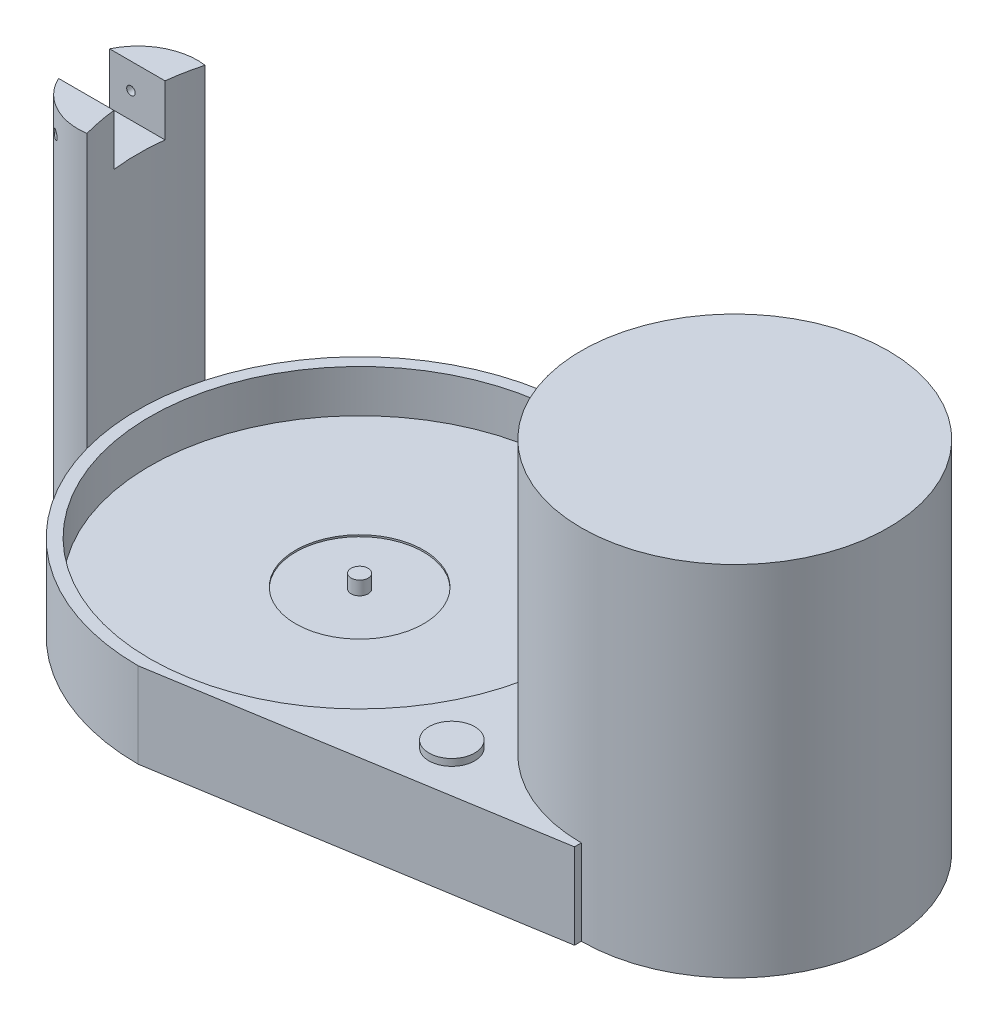
ISO-10303-21;
HEADER;
FILE_DESCRIPTION(('STEP AP214'),'2;1');
FILE_NAME('part.step','',(''),(''),'','','');
FILE_SCHEMA(('AUTOMOTIVE_DESIGN { 1 0 10303 214 1 1 1 1 }'));
ENDSEC;
DATA;
#1=APPLICATION_CONTEXT('core data for automotive mechanical design processes');
#2=APPLICATION_PROTOCOL_DEFINITION('international standard','automotive_design',2000,#1);
#3=PRODUCT_CONTEXT('',#1,'mechanical');
#4=PRODUCT('Part','Part','',(#3));
#5=PRODUCT_RELATED_PRODUCT_CATEGORY('part','',(#4));
#6=PRODUCT_DEFINITION_FORMATION('','',#4);
#7=PRODUCT_DEFINITION_CONTEXT('part definition',#1,'design');
#8=PRODUCT_DEFINITION('design','',#6,#7);
#9=PRODUCT_DEFINITION_SHAPE('','',#8);
#10=(LENGTH_UNIT() NAMED_UNIT(*) SI_UNIT(.MILLI.,.METRE.));
#11=(NAMED_UNIT(*) PLANE_ANGLE_UNIT() SI_UNIT($,.RADIAN.));
#12=(NAMED_UNIT(*) SI_UNIT($,.STERADIAN.) SOLID_ANGLE_UNIT());
#13=UNCERTAINTY_MEASURE_WITH_UNIT(LENGTH_MEASURE(1.E-05),#10,'distance_accuracy_value','');
#14=(GEOMETRIC_REPRESENTATION_CONTEXT(3) GLOBAL_UNCERTAINTY_ASSIGNED_CONTEXT((#13)) GLOBAL_UNIT_ASSIGNED_CONTEXT((#10,
#11,#12)) REPRESENTATION_CONTEXT('',''));
#15=CARTESIAN_POINT('',(0.,0.,0.));
#16=DIRECTION('',(0.,0.,1.));
#17=DIRECTION('',(1.,0.,0.));
#18=AXIS2_PLACEMENT_3D('',#15,#16,#17);
#19=CARTESIAN_POINT('',(0.,210.,0.));
#20=DIRECTION('',(0.,1.,0.));
#21=DIRECTION('',(0.,0.,1.));
#22=AXIS2_PLACEMENT_3D('',#19,#20,#21);
#23=PLANE('',#22);
#24=DIRECTION('',(-1.,0.,0.));
#25=VECTOR('',#24,1.);
#26=CARTESIAN_POINT('',(-161.622776601684,210.,-15.));
#27=LINE('',#26,#25);
#28=CARTESIAN_POINT('',(-129.13171570145,210.,-15.));
#29=VERTEX_POINT('',#28);
#30=CARTESIAN_POINT('',(-161.622776601684,210.,-15.));
#31=VERTEX_POINT('',#30);
#32=EDGE_CURVE('E157',#29,#31,#27,.T.);
#33=ORIENTED_EDGE('',*,*,#32,.F.);
#34=CARTESIAN_POINT('',(0.,210.,0.));
#35=DIRECTION('',(0.,1.,0.));
#36=DIRECTION('',(0.,0.,1.));
#37=AXIS2_PLACEMENT_3D('',#34,#35,#36);
#38=CIRCLE('',#37,130.);
#39=CARTESIAN_POINT('',(-125.288461538462,210.,-34.6814273830453));
#40=VERTEX_POINT('',#39);
#41=EDGE_CURVE('E181',#40,#29,#38,.T.);
#42=ORIENTED_EDGE('',*,*,#41,.F.);
#43=CARTESIAN_POINT('',(-130.,210.,0.));
#44=DIRECTION('',(0.,1.,0.));
#45=DIRECTION('',(0.,0.,1.));
#46=AXIS2_PLACEMENT_3D('',#43,#44,#45);
#47=CIRCLE('',#46,35.);
#48=EDGE_CURVE('E186',#40,#31,#47,.T.);
#49=ORIENTED_EDGE('',*,*,#48,.T.);
#50=EDGE_LOOP('',(#33,#42,#49));
#51=FACE_BOUND('',#50,.T.);
#52=ADVANCED_FACE('F41',(#51),#23,.T.);
#53=CARTESIAN_POINT('',(0.,50.,0.));
#54=DIRECTION('',(0.,-1.,0.));
#55=DIRECTION('',(0.,0.,-1.));
#56=AXIS2_PLACEMENT_3D('',#53,#54,#55);
#57=CYLINDRICAL_SURFACE('',#56,130.);
#58=DIRECTION('',(0.,-1.,0.));
#59=VECTOR('',#58,1.);
#60=CARTESIAN_POINT('',(-125.288461538462,210.,-34.6814273830453));
#61=LINE('',#60,#59);
#62=CARTESIAN_POINT('',(-125.288461538462,50.,-34.6814273830453));
#63=VERTEX_POINT('',#62);
#64=CARTESIAN_POINT('',(-125.288461538462,0.,-34.6814273830453));
#65=VERTEX_POINT('',#64);
#66=EDGE_CURVE('E195',#63,#65,#61,.T.);
#67=ORIENTED_EDGE('',*,*,#66,.F.);
#68=CARTESIAN_POINT('',(0.,50.,0.));
#69=DIRECTION('',(0.,1.,0.));
#70=DIRECTION('',(0.,0.,1.));
#71=AXIS2_PLACEMENT_3D('',#68,#69,#70);
#72=CIRCLE('',#71,130.);
#73=CARTESIAN_POINT('',(0.,50.,-130.));
#74=VERTEX_POINT('',#73);
#75=EDGE_CURVE('E214',#74,#63,#72,.T.);
#76=ORIENTED_EDGE('',*,*,#75,.F.);
#77=DIRECTION('',(0.,-1.,0.));
#78=VECTOR('',#77,1.);
#79=CARTESIAN_POINT('',(0.,50.,-130.));
#80=LINE('',#79,#78);
#81=CARTESIAN_POINT('',(0.,0.,-130.));
#82=VERTEX_POINT('',#81);
#83=EDGE_CURVE('E256',#74,#82,#80,.T.);
#84=ORIENTED_EDGE('',*,*,#83,.T.);
#85=CARTESIAN_POINT('',(0.,0.,0.));
#86=DIRECTION('',(0.,1.,0.));
#87=DIRECTION('',(0.,0.,1.));
#88=AXIS2_PLACEMENT_3D('',#85,#86,#87);
#89=CIRCLE('',#88,130.);
#90=EDGE_CURVE('E235',#82,#65,#89,.T.);
#91=ORIENTED_EDGE('',*,*,#90,.T.);
#92=EDGE_LOOP('',(#67,#76,#84,#91));
#93=FACE_BOUND('',#92,.T.);
#94=ADVANCED_FACE('F371',(#93),#57,.T.);
#95=DIRECTION('',(0.,-1.,0.));
#96=VECTOR('',#95,1.);
#97=CARTESIAN_POINT('',(-125.288461538462,210.,34.6814273830453));
#98=LINE('',#97,#96);
#99=CARTESIAN_POINT('',(-125.288461538462,50.,34.6814273830453));
#100=VERTEX_POINT('',#99);
#101=CARTESIAN_POINT('',(-125.288461538462,0.,34.6814273830453));
#102=VERTEX_POINT('',#101);
#103=EDGE_CURVE('E190',#100,#102,#98,.T.);
#104=ORIENTED_EDGE('',*,*,#103,.T.);
#105=CARTESIAN_POINT('',(0.,0.,130.));
#106=VERTEX_POINT('',#105);
#107=EDGE_CURVE('E234',#102,#106,#89,.T.);
#108=ORIENTED_EDGE('',*,*,#107,.T.);
#109=DIRECTION('',(0.,-1.,0.));
#110=VECTOR('',#109,1.);
#111=CARTESIAN_POINT('',(0.,50.,130.));
#112=LINE('',#111,#110);
#113=CARTESIAN_POINT('',(0.,50.,130.));
#114=VERTEX_POINT('',#113);
#115=EDGE_CURVE('E252',#114,#106,#112,.T.);
#116=ORIENTED_EDGE('',*,*,#115,.F.);
#117=EDGE_CURVE('E213',#100,#114,#72,.T.);
#118=ORIENTED_EDGE('',*,*,#117,.F.);
#119=EDGE_LOOP('',(#104,#108,#116,#118));
#120=FACE_BOUND('',#119,.T.);
#121=ADVANCED_FACE('F298',(#120),#57,.T.);
#122=CARTESIAN_POINT('',(220.,210.,0.));
#123=DIRECTION('',(0.,-1.,0.));
#124=DIRECTION('',(0.,0.,-1.));
#125=AXIS2_PLACEMENT_3D('',#122,#123,#124);
#126=CYLINDRICAL_SURFACE('',#125,90.);
#127=CARTESIAN_POINT('',(220.,210.,0.));
#128=DIRECTION('',(0.,1.,0.));
#129=DIRECTION('',(0.,0.,1.));
#130=AXIS2_PLACEMENT_3D('',#127,#128,#129);
#131=CIRCLE('',#130,90.);
#132=CARTESIAN_POINT('',(220.,210.,90.));
#133=VERTEX_POINT('',#132);
#134=EDGE_CURVE('E11',#133,#133,#131,.T.);
#135=ORIENTED_EDGE('',*,*,#134,.F.);
#136=EDGE_LOOP('',(#135));
#137=FACE_BOUND('',#136,.T.);
#138=CARTESIAN_POINT('',(220.,0.,0.));
#139=DIRECTION('',(0.,1.,0.));
#140=DIRECTION('',(0.,0.,1.));
#141=AXIS2_PLACEMENT_3D('',#138,#139,#140);
#142=CIRCLE('',#141,90.);
#143=CARTESIAN_POINT('',(220.,0.,90.));
#144=VERTEX_POINT('',#143);
#145=CARTESIAN_POINT('',(220.,0.,-90.));
#146=VERTEX_POINT('',#145);
#147=EDGE_CURVE('E51',#144,#146,#142,.T.);
#148=ORIENTED_EDGE('',*,*,#147,.T.);
#149=DIRECTION('',(0.,-1.,0.));
#150=VECTOR('',#149,1.);
#151=CARTESIAN_POINT('',(220.,50.,-90.));
#152=LINE('',#151,#150);
#153=CARTESIAN_POINT('',(220.,50.,-90.));
#154=VERTEX_POINT('',#153);
#155=EDGE_CURVE('E262',#154,#146,#152,.T.);
#156=ORIENTED_EDGE('',*,*,#155,.F.);
#157=CARTESIAN_POINT('',(220.,50.,0.));
#158=DIRECTION('',(0.,1.,0.));
#159=DIRECTION('',(0.,0.,1.));
#160=AXIS2_PLACEMENT_3D('',#157,#158,#159);
#161=CIRCLE('',#160,90.);
#162=CARTESIAN_POINT('',(220.,50.,90.));
#163=VERTEX_POINT('',#162);
#164=EDGE_CURVE('E201',#154,#163,#161,.T.);
#165=ORIENTED_EDGE('',*,*,#164,.T.);
#166=DIRECTION('',(0.,-1.,0.));
#167=VECTOR('',#166,1.);
#168=CARTESIAN_POINT('',(220.,50.,90.));
#169=LINE('',#168,#167);
#170=EDGE_CURVE('E226',#163,#144,#169,.T.);
#171=ORIENTED_EDGE('',*,*,#170,.T.);
#172=EDGE_LOOP('',(#148,#156,#165,#171));
#173=FACE_BOUND('',#172,.T.);
#174=ADVANCED_FACE('F43',(#137,#173),#126,.T.);
#175=CARTESIAN_POINT('',(0.,210.,0.));
#176=DIRECTION('',(0.,1.,0.));
#177=DIRECTION('',(0.,0.,1.));
#178=AXIS2_PLACEMENT_3D('',#175,#176,#177);
#179=PLANE('',#178);
#180=ORIENTED_EDGE('',*,*,#134,.T.);
#181=EDGE_LOOP('',(#180));
#182=FACE_BOUND('',#181,.T.);
#183=ADVANCED_FACE('F399',(#182),#179,.T.);
#184=CARTESIAN_POINT('',(0.,0.,0.));
#185=DIRECTION('',(0.,1.,0.));
#186=DIRECTION('',(0.,0.,1.));
#187=AXIS2_PLACEMENT_3D('',#184,#185,#186);
#188=PLANE('',#187);
#189=ORIENTED_EDGE('',*,*,#147,.F.);
#190=DIRECTION('',(0.,0.,-1.));
#191=VECTOR('',#190,1.);
#192=CARTESIAN_POINT('',(220.,0.,0.));
#193=LINE('',#192,#191);
#194=CARTESIAN_POINT('',(220.,0.,94.));
#195=VERTEX_POINT('',#194);
#196=EDGE_CURVE('E205',#195,#144,#193,.T.);
#197=ORIENTED_EDGE('',*,*,#196,.F.);
#198=DIRECTION('',(0.98687458289775,0.,-0.161488568110541));
#199=VECTOR('',#198,1.);
#200=CARTESIAN_POINT('',(20.7179652285898,0.,126.609787508049));
#201=LINE('',#200,#199);
#202=EDGE_CURVE('E239',#106,#195,#201,.T.);
#203=ORIENTED_EDGE('',*,*,#202,.F.);
#204=ORIENTED_EDGE('',*,*,#107,.F.);
#205=CARTESIAN_POINT('',(-130.,0.,0.));
#206=DIRECTION('',(0.,1.,0.));
#207=DIRECTION('',(0.,0.,1.));
#208=AXIS2_PLACEMENT_3D('',#205,#206,#207);
#209=CIRCLE('',#208,35.);
#210=EDGE_CURVE('E175',#65,#102,#209,.T.);
#211=ORIENTED_EDGE('',*,*,#210,.F.);
#212=ORIENTED_EDGE('',*,*,#90,.F.);
#213=DIRECTION('',(0.98687458289775,0.,0.161488568110541));
#214=VECTOR('',#213,1.);
#215=CARTESIAN_POINT('',(20.7179652285898,0.,-126.609787508049));
#216=LINE('',#215,#214);
#217=CARTESIAN_POINT('',(220.,0.,-94.));
#218=VERTEX_POINT('',#217);
#219=EDGE_CURVE('E230',#82,#218,#216,.T.);
#220=ORIENTED_EDGE('',*,*,#219,.T.);
#221=DIRECTION('',(0.,0.,1.));
#222=VECTOR('',#221,1.);
#223=CARTESIAN_POINT('',(220.,0.,0.));
#224=LINE('',#223,#222);
#225=EDGE_CURVE('E200',#218,#146,#224,.T.);
#226=ORIENTED_EDGE('',*,*,#225,.T.);
#227=EDGE_LOOP('',(#189,#197,#203,#204,#211,#212,#220,#226));
#228=FACE_BOUND('',#227,.T.);
#229=ADVANCED_FACE('F275',(#228),#188,.F.);
#230=CARTESIAN_POINT('',(220.,50.,0.));
#231=DIRECTION('',(1.,0.,0.));
#232=DIRECTION('',(0.,0.,-1.));
#233=AXIS2_PLACEMENT_3D('',#230,#231,#232);
#234=PLANE('',#233);
#235=ORIENTED_EDGE('',*,*,#225,.F.);
#236=DIRECTION('',(0.,-1.,0.));
#237=VECTOR('',#236,1.);
#238=CARTESIAN_POINT('',(220.,50.,-94.));
#239=LINE('',#238,#237);
#240=CARTESIAN_POINT('',(220.,50.,-94.));
#241=VERTEX_POINT('',#240);
#242=EDGE_CURVE('E259',#241,#218,#239,.T.);
#243=ORIENTED_EDGE('',*,*,#242,.F.);
#244=DIRECTION('',(0.,0.,1.));
#245=VECTOR('',#244,1.);
#246=CARTESIAN_POINT('',(220.,50.,0.));
#247=LINE('',#246,#245);
#248=EDGE_CURVE('E204',#241,#154,#247,.T.);
#249=ORIENTED_EDGE('',*,*,#248,.T.);
#250=ORIENTED_EDGE('',*,*,#155,.T.);
#251=EDGE_LOOP('',(#235,#243,#249,#250));
#252=FACE_BOUND('',#251,.T.);
#253=ADVANCED_FACE('F273',(#252),#234,.T.);
#254=CARTESIAN_POINT('',(20.7179652285898,50.,-126.609787508049));
#255=DIRECTION('',(0.161488568110541,0.,-0.98687458289775));
#256=DIRECTION('',(-0.98687458289775,0.,-0.161488568110541));
#257=AXIS2_PLACEMENT_3D('',#254,#255,#256);
#258=PLANE('',#257);
#259=ORIENTED_EDGE('',*,*,#219,.F.);
#260=ORIENTED_EDGE('',*,*,#83,.F.);
#261=DIRECTION('',(0.98687458289775,0.,0.161488568110541));
#262=VECTOR('',#261,1.);
#263=CARTESIAN_POINT('',(20.7179652285898,50.,-126.609787508049));
#264=LINE('',#263,#262);
#265=EDGE_CURVE('E209',#74,#241,#264,.T.);
#266=ORIENTED_EDGE('',*,*,#265,.T.);
#267=ORIENTED_EDGE('',*,*,#242,.T.);
#268=EDGE_LOOP('',(#259,#260,#266,#267));
#269=FACE_BOUND('',#268,.T.);
#270=ADVANCED_FACE('F280',(#269),#258,.T.);
#271=CARTESIAN_POINT('',(20.7179652285898,50.,126.609787508049));
#272=DIRECTION('',(-0.161488568110541,0.,-0.98687458289775));
#273=DIRECTION('',(-0.98687458289775,0.,0.161488568110541));
#274=AXIS2_PLACEMENT_3D('',#271,#272,#273);
#275=PLANE('',#274);
#276=ORIENTED_EDGE('',*,*,#202,.T.);
#277=DIRECTION('',(0.,-1.,0.));
#278=VECTOR('',#277,1.);
#279=CARTESIAN_POINT('',(220.,50.,94.));
#280=LINE('',#279,#278);
#281=CARTESIAN_POINT('',(220.,50.,94.));
#282=VERTEX_POINT('',#281);
#283=EDGE_CURVE('E248',#282,#195,#280,.T.);
#284=ORIENTED_EDGE('',*,*,#283,.F.);
#285=DIRECTION('',(0.98687458289775,0.,-0.161488568110541));
#286=VECTOR('',#285,1.);
#287=CARTESIAN_POINT('',(20.7179652285898,50.,126.609787508049));
#288=LINE('',#287,#286);
#289=EDGE_CURVE('E218',#114,#282,#288,.T.);
#290=ORIENTED_EDGE('',*,*,#289,.F.);
#291=ORIENTED_EDGE('',*,*,#115,.T.);
#292=EDGE_LOOP('',(#276,#284,#290,#291));
#293=FACE_BOUND('',#292,.T.);
#294=ADVANCED_FACE('F293',(#293),#275,.F.);
#295=CARTESIAN_POINT('',(220.,50.,0.));
#296=DIRECTION('',(-1.,0.,0.));
#297=DIRECTION('',(0.,0.,1.));
#298=AXIS2_PLACEMENT_3D('',#295,#296,#297);
#299=PLANE('',#298);
#300=ORIENTED_EDGE('',*,*,#196,.T.);
#301=ORIENTED_EDGE('',*,*,#170,.F.);
#302=DIRECTION('',(0.,0.,-1.));
#303=VECTOR('',#302,1.);
#304=CARTESIAN_POINT('',(220.,50.,0.));
#305=LINE('',#304,#303);
#306=EDGE_CURVE('E222',#282,#163,#305,.T.);
#307=ORIENTED_EDGE('',*,*,#306,.F.);
#308=ORIENTED_EDGE('',*,*,#283,.T.);
#309=EDGE_LOOP('',(#300,#301,#307,#308));
#310=FACE_BOUND('',#309,.T.);
#311=ADVANCED_FACE('F289',(#310),#299,.F.);
#312=CARTESIAN_POINT('',(0.,50.,0.));
#313=DIRECTION('',(0.,1.,0.));
#314=DIRECTION('',(0.,0.,1.));
#315=AXIS2_PLACEMENT_3D('',#312,#313,#314);
#316=PLANE('',#315);
#317=CARTESIAN_POINT('',(133.690962694127,50.,79.6250602421491));
#318=DIRECTION('',(0.,1.,0.));
#319=DIRECTION('',(0.,0.,1.));
#320=AXIS2_PLACEMENT_3D('',#317,#318,#319);
#321=CIRCLE('',#320,13.4018473309973);
#322=CARTESIAN_POINT('',(133.690962694127,50.,93.0269075731463));
#323=VERTEX_POINT('',#322);
#324=EDGE_CURVE('E628',#323,#323,#321,.T.);
#325=ORIENTED_EDGE('',*,*,#324,.F.);
#326=EDGE_LOOP('',(#325));
#327=FACE_BOUND('',#326,.T.);
#328=CARTESIAN_POINT('',(0.,50.,0.));
#329=DIRECTION('',(0.,1.,0.));
#330=DIRECTION('',(0.,0.,1.));
#331=AXIS2_PLACEMENT_3D('',#328,#329,#330);
#332=CIRCLE('',#331,123.);
#333=CARTESIAN_POINT('',(0.,50.,123.));
#334=VERTEX_POINT('',#333);
#335=EDGE_CURVE('E176',#334,#334,#332,.T.);
#336=ORIENTED_EDGE('',*,*,#335,.F.);
#337=EDGE_LOOP('',(#336));
#338=FACE_BOUND('',#337,.T.);
#339=ORIENTED_EDGE('',*,*,#164,.F.);
#340=ORIENTED_EDGE('',*,*,#248,.F.);
#341=ORIENTED_EDGE('',*,*,#265,.F.);
#342=ORIENTED_EDGE('',*,*,#75,.T.);
#343=EDGE_CURVE('E219',#63,#100,#72,.T.);
#344=ORIENTED_EDGE('',*,*,#343,.T.);
#345=ORIENTED_EDGE('',*,*,#117,.T.);
#346=ORIENTED_EDGE('',*,*,#289,.T.);
#347=ORIENTED_EDGE('',*,*,#306,.T.);
#348=EDGE_LOOP('',(#339,#340,#341,#342,#344,#345,#346,#347));
#349=FACE_BOUND('',#348,.T.);
#350=ADVANCED_FACE('F284',(#327,#338,#349),#316,.T.);
#351=CARTESIAN_POINT('',(0.,210.,0.));
#352=DIRECTION('',(0.,-1.,0.));
#353=DIRECTION('',(0.,0.,-1.));
#354=AXIS2_PLACEMENT_3D('',#351,#352,#353);
#355=CYLINDRICAL_SURFACE('',#354,130.);
#356=DIRECTION('',(0.,1.,0.));
#357=VECTOR('',#356,1.);
#358=CARTESIAN_POINT('',(-129.13171570145,180.,-15.));
#359=LINE('',#358,#357);
#360=CARTESIAN_POINT('',(-129.13171570145,180.,-15.));
#361=VERTEX_POINT('',#360);
#362=EDGE_CURVE('E166',#361,#29,#359,.T.);
#363=ORIENTED_EDGE('',*,*,#362,.F.);
#364=CARTESIAN_POINT('',(5.07927033766009E-12,180.,0.));
#365=DIRECTION('',(0.,-1.,0.));
#366=DIRECTION('',(0.,0.,1.));
#367=AXIS2_PLACEMENT_3D('',#364,#365,#366);
#368=CIRCLE('',#367,130.000000000005);
#369=CARTESIAN_POINT('',(-129.13171570145,180.,15.));
#370=VERTEX_POINT('',#369);
#371=EDGE_CURVE('E146',#370,#361,#368,.T.);
#372=ORIENTED_EDGE('',*,*,#371,.F.);
#373=DIRECTION('',(0.,1.,0.));
#374=VECTOR('',#373,1.);
#375=CARTESIAN_POINT('',(-129.13171570145,180.,15.));
#376=LINE('',#375,#374);
#377=CARTESIAN_POINT('',(-129.13171570145,210.,15.));
#378=VERTEX_POINT('',#377);
#379=EDGE_CURVE('E142',#370,#378,#376,.T.);
#380=ORIENTED_EDGE('',*,*,#379,.T.);
#381=CARTESIAN_POINT('',(-125.288461538462,210.,34.6814273830453));
#382=VERTEX_POINT('',#381);
#383=EDGE_CURVE('E185',#378,#382,#38,.T.);
#384=ORIENTED_EDGE('',*,*,#383,.T.);
#385=EDGE_CURVE('E67',#382,#100,#98,.T.);
#386=ORIENTED_EDGE('',*,*,#385,.T.);
#387=ORIENTED_EDGE('',*,*,#343,.F.);
#388=EDGE_CURVE('E196',#40,#63,#61,.T.);
#389=ORIENTED_EDGE('',*,*,#388,.F.);
#390=ORIENTED_EDGE('',*,*,#41,.T.);
#391=EDGE_LOOP('',(#363,#372,#380,#384,#386,#387,#389,#390));
#392=FACE_BOUND('',#391,.T.);
#393=ADVANCED_FACE('F368',(#392),#355,.F.);
#394=CARTESIAN_POINT('',(-130.,210.,0.));
#395=DIRECTION('',(0.,-1.,0.));
#396=DIRECTION('',(0.,0.,-1.));
#397=AXIS2_PLACEMENT_3D('',#394,#395,#396);
#398=CYLINDRICAL_SURFACE('',#397,35.);
#399=CARTESIAN_POINT('',(-151.63171570145,195.,27.5148846229029));
#400=CARTESIAN_POINT('',(-151.631715312989,195.119758558458,27.5148849931018));
#401=CARTESIAN_POINT('',(-151.623056908834,195.239520718774,27.5216986290535));
#402=CARTESIAN_POINT('',(-151.589036170781,195.475145372266,27.5483931782411));
#403=CARTESIAN_POINT('',(-151.563667006613,195.591006250488,27.5682794347076));
#404=CARTESIAN_POINT('',(-151.498005471743,195.815010383296,27.6195123641804));
#405=CARTESIAN_POINT('',(-151.457787363083,195.923188901859,27.6508019971221));
#406=CARTESIAN_POINT('',(-151.364480532346,196.130347035049,27.7229586868469));
#407=CARTESIAN_POINT('',(-151.311387900382,196.229323842536,27.7638286529721));
#408=CARTESIAN_POINT('',(-151.189589760409,196.424595084574,27.8569132688365));
#409=CARTESIAN_POINT('',(-151.119956404808,196.519991372901,27.9097864537963));
#410=CARTESIAN_POINT('',(-150.970442501132,196.697821509444,28.0223002223774));
#411=CARTESIAN_POINT('',(-150.890557331076,196.780249473412,28.0819438570134));
#412=CARTESIAN_POINT('',(-150.705135909921,196.947561829607,28.2190219869201));
#413=CARTESIAN_POINT('',(-150.597711318554,197.029429441325,28.2975849773534));
#414=CARTESIAN_POINT('',(-150.37368830976,197.173772686032,28.4593037021187));
#415=CARTESIAN_POINT('',(-150.257083171311,197.236233943135,28.5424627876993));
#416=CARTESIAN_POINT('',(-149.994871328254,197.351397072205,28.7269083331641));
#417=CARTESIAN_POINT('',(-149.847885769789,197.400165909923,28.8287061503059));
#418=CARTESIAN_POINT('',(-149.547859029422,197.469933308341,29.0329849050699));
#419=CARTESIAN_POINT('',(-149.394814210707,197.490914922506,29.135466221286));
#420=CARTESIAN_POINT('',(-149.072405709609,197.504949059876,29.3476360273725));
#421=CARTESIAN_POINT('',(-148.902802490886,197.495348034378,29.4571536209593));
#422=CARTESIAN_POINT('',(-148.565672684186,197.441051928878,29.6707870505493));
#423=CARTESIAN_POINT('',(-148.398146206947,197.396354985556,29.774902599433));
#424=CARTESIAN_POINT('',(-148.078485520663,197.273484964871,29.9700168871959));
#425=CARTESIAN_POINT('',(-147.925999090784,197.196838247045,30.0613876109236));
#426=CARTESIAN_POINT('',(-147.635578640099,197.010296983666,30.2326766854155));
#427=CARTESIAN_POINT('',(-147.497628871122,196.900438927262,30.3126074638997));
#428=CARTESIAN_POINT('',(-147.26169562872,196.66633187382,30.447492389365));
#429=CARTESIAN_POINT('',(-147.160824645951,196.546144321927,30.5043700124386));
#430=CARTESIAN_POINT('',(-147.026436925387,196.350585835106,30.5794555020499));
#431=CARTESIAN_POINT('',(-146.984459017764,196.282849447269,30.6027798151415));
#432=CARTESIAN_POINT('',(-146.906758931886,196.142794697972,30.6457740118231));
#433=CARTESIAN_POINT('',(-146.871035614928,196.07047717382,30.6654445606535));
#434=CARTESIAN_POINT('',(-146.783986632201,195.870066243055,30.71321759212));
#435=CARTESIAN_POINT('',(-146.739108890661,195.73818749889,30.7376587433866));
#436=CARTESIAN_POINT('',(-146.671814833077,195.467287190705,30.7742114610122));
#437=CARTESIAN_POINT('',(-146.649382194112,195.328270894845,30.7863319874943));
#438=CARTESIAN_POINT('',(-146.629255804696,195.061626287729,30.7972068701995));
#439=CARTESIAN_POINT('',(-146.629364111534,194.934208516805,30.7971487487569));
#440=CARTESIAN_POINT('',(-146.648870975155,194.681320818604,30.7866077913476));
#441=CARTESIAN_POINT('',(-146.668265349643,194.555850475007,30.7761272155504));
#442=CARTESIAN_POINT('',(-146.724751901388,194.313188320685,30.7454657439807));
#443=CARTESIAN_POINT('',(-146.761445367035,194.195875113886,30.7255033130968));
#444=CARTESIAN_POINT('',(-146.850738973045,193.969485749209,30.6766225777515));
#445=CARTESIAN_POINT('',(-146.903341162807,193.860410654848,30.6477031194141));
#446=CARTESIAN_POINT('',(-147.025133608637,193.647966972,30.5802203129799));
#447=CARTESIAN_POINT('',(-147.094981588302,193.545099743045,30.5412709851857));
#448=CARTESIAN_POINT('',(-147.247151297702,193.352736825889,30.4555970396998));
#449=CARTESIAN_POINT('',(-147.32947724286,193.26324567689,30.4088697938736));
#450=CARTESIAN_POINT('',(-147.512667157073,193.090531902525,30.3037736082762));
#451=CARTESIAN_POINT('',(-147.614561507734,193.008829166398,30.2447079500211));
#452=CARTESIAN_POINT('',(-147.826917028015,192.863631368349,30.1200300948048));
#453=CARTESIAN_POINT('',(-147.937382255918,192.800144999487,30.0544147923427));
#454=CARTESIAN_POINT('',(-148.179078838709,192.684237945769,29.9089201488289));
#455=CARTESIAN_POINT('',(-148.311115277723,192.634421030899,29.8283053954611));
#456=CARTESIAN_POINT('',(-148.578812295178,192.557930141074,29.662309357768));
#457=CARTESIAN_POINT('',(-148.71447459531,192.531267369271,29.5769257872869));
#458=CARTESIAN_POINT('',(-149.004867166476,192.498389617997,29.3913005841243));
#459=CARTESIAN_POINT('',(-149.159686935602,192.495440187973,29.2906149480464));
#460=CARTESIAN_POINT('',(-149.466367701971,192.517726705415,29.087702116126));
#461=CARTESIAN_POINT('',(-149.618226085862,192.542986494771,28.985473688432));
#462=CARTESIAN_POINT('',(-149.928590344001,192.624508179543,28.7730716094037));
#463=CARTESIAN_POINT('',(-150.086502079156,192.683306778543,28.6629920005479));
#464=CARTESIAN_POINT('',(-150.390039192079,192.833151679725,28.4478616684821));
#465=CARTESIAN_POINT('',(-150.535672459298,192.924177076228,28.3428077351235));
#466=CARTESIAN_POINT('',(-150.779127291603,193.114686788082,28.1646134834459));
#467=CARTESIAN_POINT('',(-150.880425472418,193.207924525206,28.0895308898053));
#468=CARTESIAN_POINT('',(-151.068897268149,193.413583918739,27.948441251804));
#469=CARTESIAN_POINT('',(-151.156090403467,193.525978612808,27.8824216843502));
#470=CARTESIAN_POINT('',(-151.298014342783,193.746577237117,27.774107974068));
#471=CARTESIAN_POINT('',(-151.355765728454,193.85178503185,27.729682996725));
#472=CARTESIAN_POINT('',(-151.456581216056,194.072795140894,27.6517484501076));
#473=CARTESIAN_POINT('',(-151.499657661444,194.188588446959,27.6182297083989));
#474=CARTESIAN_POINT('',(-151.565976476137,194.41895304753,27.5664707464559));
#475=CARTESIAN_POINT('',(-151.590487472341,194.53293591094,27.5472552626607));
#476=CARTESIAN_POINT('',(-151.623354168685,194.764612320016,27.5214644500892));
#477=CARTESIAN_POINT('',(-151.631716083218,194.88230442059,27.5148842590812));
#478=CARTESIAN_POINT('',(-151.63171570145,195.,27.5148846229029));
#479=B_SPLINE_CURVE_WITH_KNOTS('',3,(#399,#400,#401,#402,#403,#404,#405,#406,#407,#408,#409,
#410,#411,#412,#413,#414,#415,#416,#417,#418,#419,#420,#421,#422,#423,#424,#425,#426,#427,#428,
#429,#430,#431,#432,#433,#434,#435,#436,#437,#438,#439,#440,#441,#442,#443,#444,#445,#446,#447,
#448,#449,#450,#451,#452,#453,#454,#455,#456,#457,#458,#459,#460,#461,#462,#463,#464,#465,#466,
#467,#468,#469,#470,#471,#472,#473,#474,#475,#476,#477,#478),.UNSPECIFIED.,.T.,.F.,(4,2,2,2,2,2,
2,2,2,2,2,2,2,2,2,2,2,2,2,2,2,2,2,2,2,2,2,2,2,2,2,2,2,2,2,2,2,2,2,4),(0.,0.358796302032101,
0.71773934773907,1.07491105279215,1.43219136408146,1.81900718329231,2.20599801323755,
2.67301409132659,3.14037530635688,3.69405339567351,4.24806900019527,4.8514211114063,
5.45480525808417,6.03217532604724,6.60891333144454,7.10627634768286,7.3549844673517,
7.6036472602915,8.02539547975199,8.4468367646701,8.82720508611208,9.20749094046847,
9.57941105802132,9.95137910758622,10.3406474115426,10.7300475160677,11.1583574166001,
11.5868713728903,12.0725159143431,12.5583953046471,13.1102050651363,13.6624815578293,
14.2634442848386,14.864017876578,15.3327132402316,15.8007543078849,16.1831557771951,
16.5652348003729,16.9179861937555,17.2706018164017),.UNSPECIFIED.);
#480=CARTESIAN_POINT('',(-151.63171570145,195.,27.5148846229029));
#481=VERTEX_POINT('',#480);
#482=EDGE_CURVE('E316',#481,#481,#479,.T.);
#483=ORIENTED_EDGE('',*,*,#482,.T.);
#484=EDGE_LOOP('',(#483));
#485=FACE_BOUND('',#484,.T.);
#486=CARTESIAN_POINT('',(-151.63171570145,195.,-27.5148846229029));
#487=CARTESIAN_POINT('',(-151.631715312989,194.880241441542,-27.5148849931018));
#488=CARTESIAN_POINT('',(-151.623056908834,194.760479281226,-27.5216986290535));
#489=CARTESIAN_POINT('',(-151.589036170781,194.524854627734,-27.5483931782411));
#490=CARTESIAN_POINT('',(-151.563667006613,194.408993749512,-27.5682794347076));
#491=CARTESIAN_POINT('',(-151.498005471743,194.184989616704,-27.6195123641804));
#492=CARTESIAN_POINT('',(-151.457787363083,194.076811098141,-27.6508019971221));
#493=CARTESIAN_POINT('',(-151.364480532346,193.869652964951,-27.7229586868469));
#494=CARTESIAN_POINT('',(-151.311387900382,193.770676157464,-27.7638286529721));
#495=CARTESIAN_POINT('',(-151.189589760409,193.575404915426,-27.8569132688365));
#496=CARTESIAN_POINT('',(-151.119956404808,193.480008627099,-27.9097864537963));
#497=CARTESIAN_POINT('',(-150.970442501132,193.302178490556,-28.0223002223774));
#498=CARTESIAN_POINT('',(-150.890557331076,193.219750526588,-28.0819438570134));
#499=CARTESIAN_POINT('',(-150.705135909921,193.052438170393,-28.2190219869201));
#500=CARTESIAN_POINT('',(-150.597711318554,192.970570558675,-28.2975849773534));
#501=CARTESIAN_POINT('',(-150.37368830976,192.826227313968,-28.4593037021187));
#502=CARTESIAN_POINT('',(-150.257083171311,192.763766056865,-28.5424627876993));
#503=CARTESIAN_POINT('',(-149.994871328254,192.648602927795,-28.7269083331641));
#504=CARTESIAN_POINT('',(-149.847885769789,192.599834090077,-28.8287061503059));
#505=CARTESIAN_POINT('',(-149.547859029422,192.530066691659,-29.0329849050699));
#506=CARTESIAN_POINT('',(-149.394814210707,192.509085077494,-29.135466221286));
#507=CARTESIAN_POINT('',(-149.072405709609,192.495050940124,-29.3476360273725));
#508=CARTESIAN_POINT('',(-148.902802490886,192.504651965622,-29.4571536209593));
#509=CARTESIAN_POINT('',(-148.565672684186,192.558948071122,-29.6707870505493));
#510=CARTESIAN_POINT('',(-148.398146206947,192.603645014444,-29.774902599433));
#511=CARTESIAN_POINT('',(-148.078485520663,192.726515035129,-29.9700168871959));
#512=CARTESIAN_POINT('',(-147.925999090784,192.803161752955,-30.0613876109236));
#513=CARTESIAN_POINT('',(-147.635578640099,192.989703016334,-30.2326766854155));
#514=CARTESIAN_POINT('',(-147.497628871122,193.099561072738,-30.3126074638997));
#515=CARTESIAN_POINT('',(-147.26169562872,193.33366812618,-30.447492389365));
#516=CARTESIAN_POINT('',(-147.160824645951,193.453855678073,-30.5043700124386));
#517=CARTESIAN_POINT('',(-147.026436925387,193.649414164894,-30.5794555020499));
#518=CARTESIAN_POINT('',(-146.984459017764,193.717150552731,-30.6027798151415));
#519=CARTESIAN_POINT('',(-146.906758931886,193.857205302028,-30.6457740118231));
#520=CARTESIAN_POINT('',(-146.871035614928,193.92952282618,-30.6654445606535));
#521=CARTESIAN_POINT('',(-146.783986632201,194.129933756945,-30.71321759212));
#522=CARTESIAN_POINT('',(-146.739108890661,194.26181250111,-30.7376587433866));
#523=CARTESIAN_POINT('',(-146.671814833077,194.532712809295,-30.7742114610122));
#524=CARTESIAN_POINT('',(-146.649382194112,194.671729105155,-30.7863319874943));
#525=CARTESIAN_POINT('',(-146.629255804696,194.938373712271,-30.7972068701995));
#526=CARTESIAN_POINT('',(-146.629364111534,195.065791483195,-30.7971487487569));
#527=CARTESIAN_POINT('',(-146.648870975155,195.318679181396,-30.7866077913476));
#528=CARTESIAN_POINT('',(-146.668265349643,195.444149524993,-30.7761272155504));
#529=CARTESIAN_POINT('',(-146.724751901388,195.686811679315,-30.7454657439807));
#530=CARTESIAN_POINT('',(-146.761445367035,195.804124886114,-30.7255033130968));
#531=CARTESIAN_POINT('',(-146.850738973045,196.030514250791,-30.6766225777515));
#532=CARTESIAN_POINT('',(-146.903341162807,196.139589345152,-30.6477031194141));
#533=CARTESIAN_POINT('',(-147.025133608637,196.352033028,-30.5802203129799));
#534=CARTESIAN_POINT('',(-147.094981588302,196.454900256955,-30.5412709851857));
#535=CARTESIAN_POINT('',(-147.247151297702,196.647263174111,-30.4555970396998));
#536=CARTESIAN_POINT('',(-147.32947724286,196.73675432311,-30.4088697938736));
#537=CARTESIAN_POINT('',(-147.512667157073,196.909468097475,-30.3037736082762));
#538=CARTESIAN_POINT('',(-147.614561507734,196.991170833602,-30.2447079500211));
#539=CARTESIAN_POINT('',(-147.826917028015,197.136368631651,-30.1200300948048));
#540=CARTESIAN_POINT('',(-147.937382255918,197.199855000513,-30.0544147923427));
#541=CARTESIAN_POINT('',(-148.179078838709,197.315762054231,-29.9089201488289));
#542=CARTESIAN_POINT('',(-148.311115277723,197.365578969101,-29.8283053954611));
#543=CARTESIAN_POINT('',(-148.578812295178,197.442069858926,-29.662309357768));
#544=CARTESIAN_POINT('',(-148.71447459531,197.468732630729,-29.5769257872869));
#545=CARTESIAN_POINT('',(-149.004867166476,197.501610382003,-29.3913005841243));
#546=CARTESIAN_POINT('',(-149.159686935602,197.504559812027,-29.2906149480464));
#547=CARTESIAN_POINT('',(-149.466367701971,197.482273294585,-29.087702116126));
#548=CARTESIAN_POINT('',(-149.618226085862,197.457013505229,-28.985473688432));
#549=CARTESIAN_POINT('',(-149.928590344001,197.375491820457,-28.7730716094037));
#550=CARTESIAN_POINT('',(-150.086502079156,197.316693221457,-28.6629920005479));
#551=CARTESIAN_POINT('',(-150.390039192079,197.166848320275,-28.4478616684821));
#552=CARTESIAN_POINT('',(-150.535672459298,197.075822923772,-28.3428077351235));
#553=CARTESIAN_POINT('',(-150.779127291603,196.885313211918,-28.1646134834459));
#554=CARTESIAN_POINT('',(-150.880425472418,196.792075474794,-28.0895308898053));
#555=CARTESIAN_POINT('',(-151.068897268149,196.586416081261,-27.948441251804));
#556=CARTESIAN_POINT('',(-151.156090403467,196.474021387192,-27.8824216843502));
#557=CARTESIAN_POINT('',(-151.298014342783,196.253422762883,-27.774107974068));
#558=CARTESIAN_POINT('',(-151.355765728454,196.14821496815,-27.729682996725));
#559=CARTESIAN_POINT('',(-151.456581216056,195.927204859106,-27.6517484501076));
#560=CARTESIAN_POINT('',(-151.499657661444,195.811411553041,-27.6182297083989));
#561=CARTESIAN_POINT('',(-151.565976476137,195.58104695247,-27.5664707464559));
#562=CARTESIAN_POINT('',(-151.590487472341,195.46706408906,-27.5472552626607));
#563=CARTESIAN_POINT('',(-151.623354168685,195.235387679984,-27.5214644500892));
#564=CARTESIAN_POINT('',(-151.631716083218,195.11769557941,-27.5148842590812));
#565=CARTESIAN_POINT('',(-151.63171570145,195.,-27.5148846229029));
#566=B_SPLINE_CURVE_WITH_KNOTS('',3,(#486,#487,#488,#489,#490,#491,#492,#493,#494,#495,#496,
#497,#498,#499,#500,#501,#502,#503,#504,#505,#506,#507,#508,#509,#510,#511,#512,#513,#514,#515,
#516,#517,#518,#519,#520,#521,#522,#523,#524,#525,#526,#527,#528,#529,#530,#531,#532,#533,#534,
#535,#536,#537,#538,#539,#540,#541,#542,#543,#544,#545,#546,#547,#548,#549,#550,#551,#552,#553,
#554,#555,#556,#557,#558,#559,#560,#561,#562,#563,#564,#565),.UNSPECIFIED.,.T.,.F.,(4,2,2,2,2,2,
2,2,2,2,2,2,2,2,2,2,2,2,2,2,2,2,2,2,2,2,2,2,2,2,2,2,2,2,2,2,2,2,2,4),(0.,0.358796302032101,
0.71773934773907,1.07491105279215,1.43219136408146,1.81900718329231,2.20599801323755,
2.67301409132659,3.14037530635688,3.69405339567351,4.24806900019527,4.8514211114063,
5.45480525808417,6.03217532604724,6.60891333144454,7.10627634768286,7.3549844673517,
7.6036472602915,8.02539547975199,8.4468367646701,8.82720508611208,9.20749094046847,
9.57941105802132,9.95137910758622,10.3406474115426,10.7300475160677,11.1583574166001,
11.5868713728903,12.0725159143431,12.5583953046471,13.1102050651363,13.6624815578293,
14.2634442848386,14.864017876578,15.3327132402316,15.8007543078849,16.1831557771952,
16.5652348003729,16.9179861937555,17.2706018164017),.UNSPECIFIED.);
#567=CARTESIAN_POINT('',(-151.63171570145,195.,-27.5148846229029));
#568=VERTEX_POINT('',#567);
#569=EDGE_CURVE('E328',#568,#568,#566,.T.);
#570=ORIENTED_EDGE('',*,*,#569,.T.);
#571=EDGE_LOOP('',(#570));
#572=FACE_BOUND('',#571,.T.);
#573=CARTESIAN_POINT('',(-130.,180.,0.));
#574=DIRECTION('',(0.,1.,0.));
#575=DIRECTION('',(0.,0.,1.));
#576=AXIS2_PLACEMENT_3D('',#573,#574,#575);
#577=CIRCLE('',#576,35.);
#578=CARTESIAN_POINT('',(-161.622776601684,180.,-15.));
#579=VERTEX_POINT('',#578);
#580=CARTESIAN_POINT('',(-161.622776601684,180.,15.));
#581=VERTEX_POINT('',#580);
#582=EDGE_CURVE('E147',#579,#581,#577,.T.);
#583=ORIENTED_EDGE('',*,*,#582,.F.);
#584=DIRECTION('',(0.,1.,0.));
#585=VECTOR('',#584,1.);
#586=CARTESIAN_POINT('',(-161.622776601684,180.,-15.));
#587=LINE('',#586,#585);
#588=EDGE_CURVE('E180',#579,#31,#587,.T.);
#589=ORIENTED_EDGE('',*,*,#588,.T.);
#590=ORIENTED_EDGE('',*,*,#48,.F.);
#591=ORIENTED_EDGE('',*,*,#388,.T.);
#592=ORIENTED_EDGE('',*,*,#66,.T.);
#593=ORIENTED_EDGE('',*,*,#210,.T.);
#594=ORIENTED_EDGE('',*,*,#103,.F.);
#595=ORIENTED_EDGE('',*,*,#385,.F.);
#596=CARTESIAN_POINT('',(-161.622776601684,210.,15.));
#597=VERTEX_POINT('',#596);
#598=EDGE_CURVE('E161',#597,#382,#47,.T.);
#599=ORIENTED_EDGE('',*,*,#598,.F.);
#600=DIRECTION('',(0.,1.,0.));
#601=VECTOR('',#600,1.);
#602=CARTESIAN_POINT('',(-161.622776601684,180.,15.));
#603=LINE('',#602,#601);
#604=EDGE_CURVE('E59',#581,#597,#603,.T.);
#605=ORIENTED_EDGE('',*,*,#604,.F.);
#606=EDGE_LOOP('',(#583,#589,#590,#591,#592,#593,#594,#595,#599,#605));
#607=FACE_BOUND('',#606,.T.);
#608=ADVANCED_FACE('F160',(#485,#572,#607),#398,.T.);
#609=DIRECTION('',(1.,0.,0.));
#610=VECTOR('',#609,1.);
#611=CARTESIAN_POINT('',(-161.622776601684,210.,15.));
#612=LINE('',#611,#610);
#613=EDGE_CURVE('E314',#597,#378,#612,.T.);
#614=ORIENTED_EDGE('',*,*,#613,.F.);
#615=ORIENTED_EDGE('',*,*,#598,.T.);
#616=ORIENTED_EDGE('',*,*,#383,.F.);
#617=EDGE_LOOP('',(#614,#615,#616));
#618=FACE_BOUND('',#617,.T.);
#619=ADVANCED_FACE('F361',(#618),#23,.T.);
#620=CARTESIAN_POINT('',(0.,25.,0.));
#621=DIRECTION('',(0.,1.,0.));
#622=DIRECTION('',(0.,0.,1.));
#623=AXIS2_PLACEMENT_3D('',#620,#621,#622);
#624=CYLINDRICAL_SURFACE('',#623,123.);
#625=CARTESIAN_POINT('',(0.,25.,0.));
#626=DIRECTION('',(0.,1.,0.));
#627=DIRECTION('',(0.,0.,1.));
#628=AXIS2_PLACEMENT_3D('',#625,#626,#627);
#629=CIRCLE('',#628,123.);
#630=CARTESIAN_POINT('',(0.,25.,123.));
#631=VERTEX_POINT('',#630);
#632=EDGE_CURVE('E171',#631,#631,#629,.T.);
#633=ORIENTED_EDGE('',*,*,#632,.F.);
#634=EDGE_LOOP('',(#633));
#635=FACE_BOUND('',#634,.T.);
#636=ORIENTED_EDGE('',*,*,#335,.T.);
#637=EDGE_LOOP('',(#636));
#638=FACE_BOUND('',#637,.T.);
#639=ADVANCED_FACE('F358',(#635,#638),#624,.F.);
#640=CARTESIAN_POINT('',(0.,25.,0.));
#641=DIRECTION('',(0.,1.,0.));
#642=DIRECTION('',(0.,0.,1.));
#643=AXIS2_PLACEMENT_3D('',#640,#641,#642);
#644=PLANE('',#643);
#645=CARTESIAN_POINT('',(0.,25.,0.));
#646=DIRECTION('',(0.,1.,0.));
#647=DIRECTION('',(0.,0.,1.));
#648=AXIS2_PLACEMENT_3D('',#645,#646,#647);
#649=CIRCLE('',#648,37.5);
#650=CARTESIAN_POINT('',(0.,25.,37.5));
#651=VERTEX_POINT('',#650);
#652=EDGE_CURVE('E485',#651,#651,#649,.T.);
#653=ORIENTED_EDGE('',*,*,#652,.F.);
#654=EDGE_LOOP('',(#653));
#655=FACE_BOUND('',#654,.T.);
#656=ORIENTED_EDGE('',*,*,#632,.T.);
#657=EDGE_LOOP('',(#656));
#658=FACE_BOUND('',#657,.T.);
#659=ADVANCED_FACE('F351',(#655,#658),#644,.T.);
#660=CARTESIAN_POINT('',(-161.622776601684,180.,-15.));
#661=DIRECTION('',(0.,0.,-1.));
#662=DIRECTION('',(-1.,0.,0.));
#663=AXIS2_PLACEMENT_3D('',#660,#661,#662);
#664=PLANE('',#663);
#665=CARTESIAN_POINT('',(-149.13171570145,195.,-15.));
#666=DIRECTION('',(0.,0.,-1.));
#667=DIRECTION('',(-1.,0.,0.));
#668=AXIS2_PLACEMENT_3D('',#665,#666,#667);
#669=CIRCLE('',#668,2.5);
#670=CARTESIAN_POINT('',(-151.63171570145,195.,-15.));
#671=VERTEX_POINT('',#670);
#672=EDGE_CURVE('E490',#671,#671,#669,.T.);
#673=ORIENTED_EDGE('',*,*,#672,.T.);
#674=EDGE_LOOP('',(#673));
#675=FACE_BOUND('',#674,.T.);
#676=ORIENTED_EDGE('',*,*,#32,.T.);
#677=ORIENTED_EDGE('',*,*,#588,.F.);
#678=DIRECTION('',(-1.,0.,0.));
#679=VECTOR('',#678,1.);
#680=CARTESIAN_POINT('',(-161.622776601684,180.,-15.));
#681=LINE('',#680,#679);
#682=EDGE_CURVE('E153',#361,#579,#681,.T.);
#683=ORIENTED_EDGE('',*,*,#682,.F.);
#684=ORIENTED_EDGE('',*,*,#362,.T.);
#685=EDGE_LOOP('',(#676,#677,#683,#684));
#686=FACE_BOUND('',#685,.T.);
#687=ADVANCED_FACE('F348',(#675,#686),#664,.F.);
#688=CARTESIAN_POINT('',(-161.622776601684,180.,15.));
#689=DIRECTION('',(0.,0.,1.));
#690=DIRECTION('',(1.,0.,0.));
#691=AXIS2_PLACEMENT_3D('',#688,#689,#690);
#692=PLANE('',#691);
#693=CARTESIAN_POINT('',(-149.13171570145,195.,15.));
#694=DIRECTION('',(0.,0.,1.));
#695=DIRECTION('',(1.,0.,0.));
#696=AXIS2_PLACEMENT_3D('',#693,#694,#695);
#697=CIRCLE('',#696,2.5);
#698=CARTESIAN_POINT('',(-146.63171570145,195.,15.));
#699=VERTEX_POINT('',#698);
#700=EDGE_CURVE('E45',#699,#699,#697,.T.);
#701=ORIENTED_EDGE('',*,*,#700,.T.);
#702=EDGE_LOOP('',(#701));
#703=FACE_BOUND('',#702,.T.);
#704=ORIENTED_EDGE('',*,*,#613,.T.);
#705=ORIENTED_EDGE('',*,*,#379,.F.);
#706=DIRECTION('',(1.,0.,0.));
#707=VECTOR('',#706,1.);
#708=CARTESIAN_POINT('',(-161.622776601684,180.,15.));
#709=LINE('',#708,#707);
#710=EDGE_CURVE('E138',#581,#370,#709,.T.);
#711=ORIENTED_EDGE('',*,*,#710,.F.);
#712=ORIENTED_EDGE('',*,*,#604,.T.);
#713=EDGE_LOOP('',(#704,#705,#711,#712));
#714=FACE_BOUND('',#713,.T.);
#715=ADVANCED_FACE('F140',(#703,#714),#692,.F.);
#716=CARTESIAN_POINT('',(-130.,180.,0.));
#717=DIRECTION('',(0.,1.,0.));
#718=DIRECTION('',(0.,0.,1.));
#719=AXIS2_PLACEMENT_3D('',#716,#717,#718);
#720=PLANE('',#719);
#721=ORIENTED_EDGE('',*,*,#582,.T.);
#722=ORIENTED_EDGE('',*,*,#710,.T.);
#723=ORIENTED_EDGE('',*,*,#371,.T.);
#724=ORIENTED_EDGE('',*,*,#682,.T.);
#725=EDGE_LOOP('',(#721,#722,#723,#724));
#726=FACE_BOUND('',#725,.T.);
#727=ADVANCED_FACE('F151',(#726),#720,.T.);
#728=CARTESIAN_POINT('',(-149.13171570145,195.,130.));
#729=DIRECTION('',(0.,0.,-1.));
#730=DIRECTION('',(-1.,0.,0.));
#731=AXIS2_PLACEMENT_3D('',#728,#729,#730);
#732=CYLINDRICAL_SURFACE('',#731,2.5);
#733=ORIENTED_EDGE('',*,*,#700,.F.);
#734=EDGE_LOOP('',(#733));
#735=FACE_BOUND('',#734,.T.);
#736=ORIENTED_EDGE('',*,*,#482,.F.);
#737=EDGE_LOOP('',(#736));
#738=FACE_BOUND('',#737,.T.);
#739=ADVANCED_FACE('F336',(#735,#738),#732,.F.);
#740=ORIENTED_EDGE('',*,*,#672,.F.);
#741=EDGE_LOOP('',(#740));
#742=FACE_BOUND('',#741,.T.);
#743=ORIENTED_EDGE('',*,*,#569,.F.);
#744=EDGE_LOOP('',(#743));
#745=FACE_BOUND('',#744,.T.);
#746=ADVANCED_FACE('F341',(#742,#745),#732,.F.);
#747=CARTESIAN_POINT('',(0.,24.,0.));
#748=DIRECTION('',(0.,1.,0.));
#749=DIRECTION('',(0.,0.,1.));
#750=AXIS2_PLACEMENT_3D('',#747,#748,#749);
#751=CYLINDRICAL_SURFACE('',#750,37.5);
#752=CARTESIAN_POINT('',(0.,24.,0.));
#753=DIRECTION('',(0.,1.,0.));
#754=DIRECTION('',(0.,0.,1.));
#755=AXIS2_PLACEMENT_3D('',#752,#753,#754);
#756=CIRCLE('',#755,37.5);
#757=CARTESIAN_POINT('',(0.,24.,37.5));
#758=VERTEX_POINT('',#757);
#759=EDGE_CURVE('E483',#758,#758,#756,.T.);
#760=ORIENTED_EDGE('',*,*,#759,.F.);
#761=EDGE_LOOP('',(#760));
#762=FACE_BOUND('',#761,.T.);
#763=ORIENTED_EDGE('',*,*,#652,.T.);
#764=EDGE_LOOP('',(#763));
#765=FACE_BOUND('',#764,.T.);
#766=ADVANCED_FACE('F343',(#762,#765),#751,.F.);
#767=CARTESIAN_POINT('',(0.,24.,0.));
#768=DIRECTION('',(0.,1.,0.));
#769=DIRECTION('',(0.,0.,1.));
#770=AXIS2_PLACEMENT_3D('',#767,#768,#769);
#771=PLANE('',#770);
#772=CARTESIAN_POINT('',(0.,24.,0.));
#773=DIRECTION('',(0.,1.,0.));
#774=DIRECTION('',(0.,0.,1.));
#775=AXIS2_PLACEMENT_3D('',#772,#773,#774);
#776=CIRCLE('',#775,5.);
#777=CARTESIAN_POINT('',(0.,24.,5.));
#778=VERTEX_POINT('',#777);
#779=EDGE_CURVE('E480',#778,#778,#776,.T.);
#780=ORIENTED_EDGE('',*,*,#779,.F.);
#781=EDGE_LOOP('',(#780));
#782=FACE_BOUND('',#781,.T.);
#783=ORIENTED_EDGE('',*,*,#759,.T.);
#784=EDGE_LOOP('',(#783));
#785=FACE_BOUND('',#784,.T.);
#786=ADVANCED_FACE('F469',(#782,#785),#771,.T.);
#787=CARTESIAN_POINT('',(0.,32.,0.));
#788=DIRECTION('',(0.,-1.,0.));
#789=DIRECTION('',(0.,0.,-1.));
#790=AXIS2_PLACEMENT_3D('',#787,#788,#789);
#791=CYLINDRICAL_SURFACE('',#790,5.);
#792=CARTESIAN_POINT('',(0.,32.,0.));
#793=DIRECTION('',(0.,1.,0.));
#794=DIRECTION('',(0.,0.,1.));
#795=AXIS2_PLACEMENT_3D('',#792,#793,#794);
#796=CIRCLE('',#795,5.);
#797=CARTESIAN_POINT('',(0.,32.,5.));
#798=VERTEX_POINT('',#797);
#799=EDGE_CURVE('E492',#798,#798,#796,.T.);
#800=ORIENTED_EDGE('',*,*,#799,.F.);
#801=EDGE_LOOP('',(#800));
#802=FACE_BOUND('',#801,.T.);
#803=ORIENTED_EDGE('',*,*,#779,.T.);
#804=EDGE_LOOP('',(#803));
#805=FACE_BOUND('',#804,.T.);
#806=ADVANCED_FACE('F466',(#802,#805),#791,.T.);
#807=CARTESIAN_POINT('',(0.,32.,0.));
#808=DIRECTION('',(0.,1.,0.));
#809=DIRECTION('',(0.,0.,1.));
#810=AXIS2_PLACEMENT_3D('',#807,#808,#809);
#811=PLANE('',#810);
#812=ORIENTED_EDGE('',*,*,#799,.T.);
#813=EDGE_LOOP('',(#812));
#814=FACE_BOUND('',#813,.T.);
#815=ADVANCED_FACE('F439',(#814),#811,.T.);
#816=CARTESIAN_POINT('',(133.690962694127,54.,79.6250602421491));
#817=DIRECTION('',(0.,-1.,0.));
#818=DIRECTION('',(0.,0.,-1.));
#819=AXIS2_PLACEMENT_3D('',#816,#817,#818);
#820=CYLINDRICAL_SURFACE('',#819,13.4018473309973);
#821=CARTESIAN_POINT('',(133.690962694127,54.,79.6250602421491));
#822=DIRECTION('',(0.,1.,0.));
#823=DIRECTION('',(0.,0.,1.));
#824=AXIS2_PLACEMENT_3D('',#821,#822,#823);
#825=CIRCLE('',#824,13.4018473309973);
#826=CARTESIAN_POINT('',(133.690962694127,54.,93.0269075731463));
#827=VERTEX_POINT('',#826);
#828=EDGE_CURVE('E624',#827,#827,#825,.T.);
#829=ORIENTED_EDGE('',*,*,#828,.F.);
#830=EDGE_LOOP('',(#829));
#831=FACE_BOUND('',#830,.T.);
#832=ORIENTED_EDGE('',*,*,#324,.T.);
#833=EDGE_LOOP('',(#832));
#834=FACE_BOUND('',#833,.T.);
#835=ADVANCED_FACE('F444',(#831,#834),#820,.T.);
#836=CARTESIAN_POINT('',(133.690962694127,54.,79.6250602421491));
#837=DIRECTION('',(0.,1.,0.));
#838=DIRECTION('',(0.,0.,1.));
#839=AXIS2_PLACEMENT_3D('',#836,#837,#838);
#840=PLANE('',#839);
#841=ORIENTED_EDGE('',*,*,#828,.T.);
#842=EDGE_LOOP('',(#841));
#843=FACE_BOUND('',#842,.T.);
#844=ADVANCED_FACE('F449',(#843),#840,.T.);
#845=CLOSED_SHELL('',(#52,#94,#121,#174,#183,#229,#253,#270,#294,#311,#350,#393,#608,#619,#639,
#659,#687,#715,#727,#739,#746,#766,#786,#806,#815,#835,#844));
#846=MANIFOLD_SOLID_BREP('B2',#845);
#847=ADVANCED_BREP_SHAPE_REPRESENTATION('',(#18,#846),#14);
#848=SHAPE_DEFINITION_REPRESENTATION(#9,#847);
ENDSEC;
END-ISO-10303-21;
